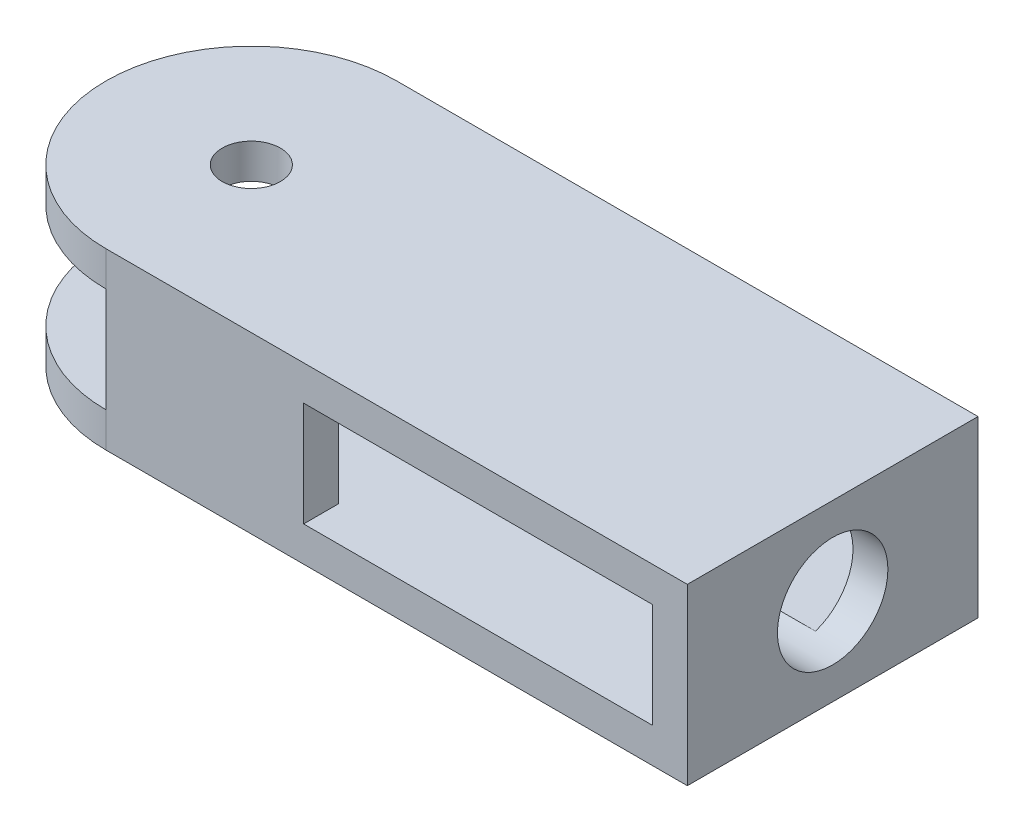
ISO-10303-21;
HEADER;
FILE_DESCRIPTION(('STEP AP214'),'2;1');
FILE_NAME('part.step','',(''),(''),'','','');
FILE_SCHEMA(('AUTOMOTIVE_DESIGN { 1 0 10303 214 1 1 1 1 }'));
ENDSEC;
DATA;
#1=APPLICATION_CONTEXT('core data for automotive mechanical design processes');
#2=APPLICATION_PROTOCOL_DEFINITION('international standard','automotive_design',2000,#1);
#3=PRODUCT_CONTEXT('',#1,'mechanical');
#4=PRODUCT('Part','Part','',(#3));
#5=PRODUCT_RELATED_PRODUCT_CATEGORY('part','',(#4));
#6=PRODUCT_DEFINITION_FORMATION('','',#4);
#7=PRODUCT_DEFINITION_CONTEXT('part definition',#1,'design');
#8=PRODUCT_DEFINITION('design','',#6,#7);
#9=PRODUCT_DEFINITION_SHAPE('','',#8);
#10=(LENGTH_UNIT() NAMED_UNIT(*) SI_UNIT(.MILLI.,.METRE.));
#11=(NAMED_UNIT(*) PLANE_ANGLE_UNIT() SI_UNIT($,.RADIAN.));
#12=(NAMED_UNIT(*) SI_UNIT($,.STERADIAN.) SOLID_ANGLE_UNIT());
#13=UNCERTAINTY_MEASURE_WITH_UNIT(LENGTH_MEASURE(1.E-05),#10,'distance_accuracy_value','');
#14=(GEOMETRIC_REPRESENTATION_CONTEXT(3) GLOBAL_UNCERTAINTY_ASSIGNED_CONTEXT((#13)) GLOBAL_UNIT_ASSIGNED_CONTEXT((#10,
#11,#12)) REPRESENTATION_CONTEXT('',''));
#15=CARTESIAN_POINT('',(0.,0.,0.));
#16=DIRECTION('',(0.,0.,1.));
#17=DIRECTION('',(1.,0.,0.));
#18=AXIS2_PLACEMENT_3D('',#15,#16,#17);
#19=CARTESIAN_POINT('',(-50.,15.,0.));
#20=DIRECTION('',(0.,-1.,0.));
#21=DIRECTION('',(0.,0.,-1.));
#22=AXIS2_PLACEMENT_3D('',#19,#20,#21);
#23=CYLINDRICAL_SURFACE('',#22,5.);
#24=CARTESIAN_POINT('',(-50.,-9.,0.));
#25=DIRECTION('',(0.,-1.,0.));
#26=DIRECTION('',(1.,0.,0.));
#27=AXIS2_PLACEMENT_3D('',#24,#25,#26);
#28=CIRCLE('',#27,5.);
#29=CARTESIAN_POINT('',(-45.,-9.,0.));
#30=VERTEX_POINT('',#29);
#31=EDGE_CURVE('E43',#30,#30,#28,.T.);
#32=ORIENTED_EDGE('',*,*,#31,.F.);
#33=EDGE_LOOP('',(#32));
#34=FACE_BOUND('',#33,.T.);
#35=CARTESIAN_POINT('',(-50.,-15.,0.));
#36=DIRECTION('',(0.,1.,0.));
#37=DIRECTION('',(0.,0.,1.));
#38=AXIS2_PLACEMENT_3D('',#35,#36,#37);
#39=CIRCLE('',#38,5.);
#40=CARTESIAN_POINT('',(-50.,-15.,5.));
#41=VERTEX_POINT('',#40);
#42=EDGE_CURVE('E239',#41,#41,#39,.T.);
#43=ORIENTED_EDGE('',*,*,#42,.F.);
#44=EDGE_LOOP('',(#43));
#45=FACE_BOUND('',#44,.T.);
#46=ADVANCED_FACE('F35',(#34,#45),#23,.F.);
#47=CARTESIAN_POINT('',(-16.,9.,-25.));
#48=DIRECTION('',(-1.,0.,0.));
#49=DIRECTION('',(0.,0.,1.));
#50=AXIS2_PLACEMENT_3D('',#47,#48,#49);
#51=PLANE('',#50);
#52=DIRECTION('',(0.,0.,1.));
#53=VECTOR('',#52,1.);
#54=CARTESIAN_POINT('',(-16.,9.,-25.));
#55=LINE('',#54,#53);
#56=CARTESIAN_POINT('',(-16.,9.,-25.));
#57=VERTEX_POINT('',#56);
#58=CARTESIAN_POINT('',(-16.,9.,-19.));
#59=VERTEX_POINT('',#58);
#60=EDGE_CURVE('E187',#57,#59,#55,.T.);
#61=ORIENTED_EDGE('',*,*,#60,.T.);
#62=DIRECTION('',(0.,1.,0.));
#63=VECTOR('',#62,1.);
#64=CARTESIAN_POINT('',(-16.,8.99999999999999,-19.));
#65=LINE('',#64,#63);
#66=CARTESIAN_POINT('',(-16.,-9.,-19.));
#67=VERTEX_POINT('',#66);
#68=EDGE_CURVE('E50',#67,#59,#65,.T.);
#69=ORIENTED_EDGE('',*,*,#68,.F.);
#70=DIRECTION('',(0.,0.,1.));
#71=VECTOR('',#70,1.);
#72=CARTESIAN_POINT('',(-16.,-9.,-25.));
#73=LINE('',#72,#71);
#74=CARTESIAN_POINT('',(-16.,-9.,-25.));
#75=VERTEX_POINT('',#74);
#76=EDGE_CURVE('E202',#75,#67,#73,.T.);
#77=ORIENTED_EDGE('',*,*,#76,.F.);
#78=DIRECTION('',(0.,-1.,0.));
#79=VECTOR('',#78,1.);
#80=CARTESIAN_POINT('',(-16.,9.,-25.));
#81=LINE('',#80,#79);
#82=EDGE_CURVE('E377',#57,#75,#81,.T.);
#83=ORIENTED_EDGE('',*,*,#82,.F.);
#84=EDGE_LOOP('',(#61,#69,#77,#83));
#85=FACE_BOUND('',#84,.T.);
#86=ADVANCED_FACE('F299',(#85),#51,.F.);
#87=CARTESIAN_POINT('',(-50.,15.,0.));
#88=DIRECTION('',(0.,-1.,0.));
#89=DIRECTION('',(0.,0.,-1.));
#90=AXIS2_PLACEMENT_3D('',#87,#88,#89);
#91=CYLINDRICAL_SURFACE('',#90,25.);
#92=DIRECTION('',(0.,-1.,0.));
#93=VECTOR('',#92,1.);
#94=CARTESIAN_POINT('',(-50.,15.,25.));
#95=LINE('',#94,#93);
#96=CARTESIAN_POINT('',(-50.,-9.,25.));
#97=VERTEX_POINT('',#96);
#98=CARTESIAN_POINT('',(-50.,-15.,25.));
#99=VERTEX_POINT('',#98);
#100=EDGE_CURVE('E271',#97,#99,#95,.T.);
#101=ORIENTED_EDGE('',*,*,#100,.F.);
#102=CARTESIAN_POINT('',(-50.,-9.,0.));
#103=DIRECTION('',(0.,-1.,0.));
#104=DIRECTION('',(1.,0.,0.));
#105=AXIS2_PLACEMENT_3D('',#102,#103,#104);
#106=CIRCLE('',#105,25.);
#107=CARTESIAN_POINT('',(-50.,-9.,-25.));
#108=VERTEX_POINT('',#107);
#109=EDGE_CURVE('E233',#97,#108,#106,.T.);
#110=ORIENTED_EDGE('',*,*,#109,.T.);
#111=DIRECTION('',(0.,-1.,0.));
#112=VECTOR('',#111,1.);
#113=CARTESIAN_POINT('',(-50.,15.,-25.));
#114=LINE('',#113,#112);
#115=CARTESIAN_POINT('',(-50.,-15.,-25.));
#116=VERTEX_POINT('',#115);
#117=EDGE_CURVE('E275',#108,#116,#114,.T.);
#118=ORIENTED_EDGE('',*,*,#117,.T.);
#119=CARTESIAN_POINT('',(-50.,-15.,0.));
#120=DIRECTION('',(0.,1.,0.));
#121=DIRECTION('',(0.,0.,1.));
#122=AXIS2_PLACEMENT_3D('',#119,#120,#121);
#123=CIRCLE('',#122,25.);
#124=EDGE_CURVE('E265',#116,#99,#123,.T.);
#125=ORIENTED_EDGE('',*,*,#124,.T.);
#126=EDGE_LOOP('',(#101,#110,#118,#125));
#127=FACE_BOUND('',#126,.T.);
#128=ADVANCED_FACE('F327',(#127),#91,.T.);
#129=CARTESIAN_POINT('',(0.,0.,0.));
#130=DIRECTION('',(1.,0.,0.));
#131=DIRECTION('',(0.,0.,-1.));
#132=AXIS2_PLACEMENT_3D('',#129,#130,#131);
#133=PLANE('',#132);
#134=DIRECTION('',(0.,0.,1.));
#135=VECTOR('',#134,1.);
#136=CARTESIAN_POINT('',(0.,9.,0.));
#137=LINE('',#136,#135);
#138=CARTESIAN_POINT('',(0.,9.,-3.04138126514911));
#139=VERTEX_POINT('',#138);
#140=CARTESIAN_POINT('',(0.,9.,3.04138126514911));
#141=VERTEX_POINT('',#140);
#142=EDGE_CURVE('E284',#139,#141,#137,.T.);
#143=ORIENTED_EDGE('',*,*,#142,.F.);
#144=CARTESIAN_POINT('',(0.,0.,0.));
#145=DIRECTION('',(1.,0.,0.));
#146=DIRECTION('',(0.,0.,-1.));
#147=AXIS2_PLACEMENT_3D('',#144,#145,#146);
#148=CIRCLE('',#147,9.5);
#149=EDGE_CURVE('E236',#139,#141,#148,.T.);
#150=ORIENTED_EDGE('',*,*,#149,.T.);
#151=EDGE_LOOP('',(#143,#150));
#152=FACE_BOUND('',#151,.T.);
#153=ADVANCED_FACE('F315',(#152),#133,.T.);
#154=CARTESIAN_POINT('',(-50.,15.,0.));
#155=DIRECTION('',(0.,1.,0.));
#156=DIRECTION('',(0.,0.,1.));
#157=AXIS2_PLACEMENT_3D('',#154,#155,#156);
#158=PLANE('',#157);
#159=DIRECTION('',(0.,0.,-1.));
#160=VECTOR('',#159,1.);
#161=CARTESIAN_POINT('',(50.,15.,-25.));
#162=LINE('',#161,#160);
#163=CARTESIAN_POINT('',(50.,15.,25.));
#164=VERTEX_POINT('',#163);
#165=CARTESIAN_POINT('',(50.,15.,-25.));
#166=VERTEX_POINT('',#165);
#167=EDGE_CURVE('E249',#164,#166,#162,.T.);
#168=ORIENTED_EDGE('',*,*,#167,.T.);
#169=DIRECTION('',(-1.,0.,0.));
#170=VECTOR('',#169,1.);
#171=CARTESIAN_POINT('',(-50.,15.,-25.));
#172=LINE('',#171,#170);
#173=CARTESIAN_POINT('',(-50.,15.,-25.));
#174=VERTEX_POINT('',#173);
#175=EDGE_CURVE('E252',#166,#174,#172,.T.);
#176=ORIENTED_EDGE('',*,*,#175,.T.);
#177=CARTESIAN_POINT('',(-50.,15.,0.));
#178=DIRECTION('',(0.,1.,0.));
#179=DIRECTION('',(0.,0.,1.));
#180=AXIS2_PLACEMENT_3D('',#177,#178,#179);
#181=CIRCLE('',#180,25.);
#182=CARTESIAN_POINT('',(-50.,15.,25.));
#183=VERTEX_POINT('',#182);
#184=EDGE_CURVE('E255',#174,#183,#181,.T.);
#185=ORIENTED_EDGE('',*,*,#184,.T.);
#186=DIRECTION('',(1.,0.,0.));
#187=VECTOR('',#186,1.);
#188=CARTESIAN_POINT('',(-50.,15.,25.));
#189=LINE('',#188,#187);
#190=EDGE_CURVE('E257',#183,#164,#189,.T.);
#191=ORIENTED_EDGE('',*,*,#190,.T.);
#192=EDGE_LOOP('',(#168,#176,#185,#191));
#193=FACE_BOUND('',#192,.T.);
#194=CARTESIAN_POINT('',(-50.,15.,0.));
#195=DIRECTION('',(0.,1.,0.));
#196=DIRECTION('',(0.,0.,1.));
#197=AXIS2_PLACEMENT_3D('',#194,#195,#196);
#198=CIRCLE('',#197,5.);
#199=CARTESIAN_POINT('',(-50.,15.,5.));
#200=VERTEX_POINT('',#199);
#201=EDGE_CURVE('E243',#200,#200,#198,.T.);
#202=ORIENTED_EDGE('',*,*,#201,.F.);
#203=EDGE_LOOP('',(#202));
#204=FACE_BOUND('',#203,.T.);
#205=ADVANCED_FACE('F306',(#193,#204),#158,.T.);
#206=CARTESIAN_POINT('',(-50.,-15.,0.));
#207=DIRECTION('',(0.,1.,0.));
#208=DIRECTION('',(0.,0.,1.));
#209=AXIS2_PLACEMENT_3D('',#206,#207,#208);
#210=PLANE('',#209);
#211=DIRECTION('',(0.,0.,-1.));
#212=VECTOR('',#211,1.);
#213=CARTESIAN_POINT('',(50.,-15.,-25.));
#214=LINE('',#213,#212);
#215=CARTESIAN_POINT('',(50.,-15.,25.));
#216=VERTEX_POINT('',#215);
#217=CARTESIAN_POINT('',(50.,-15.,-25.));
#218=VERTEX_POINT('',#217);
#219=EDGE_CURVE('E246',#216,#218,#214,.T.);
#220=ORIENTED_EDGE('',*,*,#219,.F.);
#221=DIRECTION('',(1.,0.,0.));
#222=VECTOR('',#221,1.);
#223=CARTESIAN_POINT('',(-50.,-15.,25.));
#224=LINE('',#223,#222);
#225=EDGE_CURVE('E253',#99,#216,#224,.T.);
#226=ORIENTED_EDGE('',*,*,#225,.F.);
#227=ORIENTED_EDGE('',*,*,#124,.F.);
#228=DIRECTION('',(-1.,0.,0.));
#229=VECTOR('',#228,1.);
#230=CARTESIAN_POINT('',(-50.,-15.,-25.));
#231=LINE('',#230,#229);
#232=EDGE_CURVE('E262',#218,#116,#231,.T.);
#233=ORIENTED_EDGE('',*,*,#232,.F.);
#234=EDGE_LOOP('',(#220,#226,#227,#233));
#235=FACE_BOUND('',#234,.T.);
#236=ORIENTED_EDGE('',*,*,#42,.T.);
#237=EDGE_LOOP('',(#236));
#238=FACE_BOUND('',#237,.T.);
#239=ADVANCED_FACE('F304',(#235,#238),#210,.F.);
#240=CARTESIAN_POINT('',(50.,15.,-25.));
#241=DIRECTION('',(-1.,0.,0.));
#242=DIRECTION('',(0.,0.,1.));
#243=AXIS2_PLACEMENT_3D('',#240,#241,#242);
#244=PLANE('',#243);
#245=CARTESIAN_POINT('',(50.,0.,0.));
#246=DIRECTION('',(1.,0.,0.));
#247=DIRECTION('',(0.,0.,-1.));
#248=AXIS2_PLACEMENT_3D('',#245,#246,#247);
#249=CIRCLE('',#248,9.5);
#250=CARTESIAN_POINT('',(50.,0.,-9.5));
#251=VERTEX_POINT('',#250);
#252=EDGE_CURVE('E235',#251,#251,#249,.T.);
#253=ORIENTED_EDGE('',*,*,#252,.F.);
#254=EDGE_LOOP('',(#253));
#255=FACE_BOUND('',#254,.T.);
#256=ORIENTED_EDGE('',*,*,#219,.T.);
#257=DIRECTION('',(0.,-1.,0.));
#258=VECTOR('',#257,1.);
#259=CARTESIAN_POINT('',(50.,15.,-25.));
#260=LINE('',#259,#258);
#261=EDGE_CURVE('E279',#166,#218,#260,.T.);
#262=ORIENTED_EDGE('',*,*,#261,.F.);
#263=ORIENTED_EDGE('',*,*,#167,.F.);
#264=DIRECTION('',(0.,-1.,0.));
#265=VECTOR('',#264,1.);
#266=CARTESIAN_POINT('',(50.,15.,25.));
#267=LINE('',#266,#265);
#268=EDGE_CURVE('E259',#164,#216,#267,.T.);
#269=ORIENTED_EDGE('',*,*,#268,.T.);
#270=EDGE_LOOP('',(#256,#262,#263,#269));
#271=FACE_BOUND('',#270,.T.);
#272=ADVANCED_FACE('F37',(#255,#271),#244,.F.);
#273=CARTESIAN_POINT('',(-50.,15.,-25.));
#274=DIRECTION('',(0.,0.,1.));
#275=DIRECTION('',(1.,0.,0.));
#276=AXIS2_PLACEMENT_3D('',#273,#274,#275);
#277=PLANE('',#276);
#278=DIRECTION('',(-1.,0.,0.));
#279=VECTOR('',#278,1.);
#280=CARTESIAN_POINT('',(-16.,9.,-25.));
#281=LINE('',#280,#279);
#282=CARTESIAN_POINT('',(44.,9.,-25.));
#283=VERTEX_POINT('',#282);
#284=EDGE_CURVE('E196',#283,#57,#281,.T.);
#285=ORIENTED_EDGE('',*,*,#284,.T.);
#286=ORIENTED_EDGE('',*,*,#82,.T.);
#287=DIRECTION('',(1.,0.,0.));
#288=VECTOR('',#287,1.);
#289=CARTESIAN_POINT('',(-16.,-9.,-25.));
#290=LINE('',#289,#288);
#291=CARTESIAN_POINT('',(44.,-9.,-25.));
#292=VERTEX_POINT('',#291);
#293=EDGE_CURVE('E379',#75,#292,#290,.T.);
#294=ORIENTED_EDGE('',*,*,#293,.T.);
#295=DIRECTION('',(0.,1.,0.));
#296=VECTOR('',#295,1.);
#297=CARTESIAN_POINT('',(44.,9.,-25.));
#298=LINE('',#297,#296);
#299=EDGE_CURVE('E58',#292,#283,#298,.T.);
#300=ORIENTED_EDGE('',*,*,#299,.T.);
#301=EDGE_LOOP('',(#285,#286,#294,#300));
#302=FACE_BOUND('',#301,.T.);
#303=ORIENTED_EDGE('',*,*,#232,.T.);
#304=ORIENTED_EDGE('',*,*,#117,.F.);
#305=DIRECTION('',(0.,1.,0.));
#306=VECTOR('',#305,1.);
#307=CARTESIAN_POINT('',(-50.,9.,-25.));
#308=LINE('',#307,#306);
#309=CARTESIAN_POINT('',(-50.,9.,-25.));
#310=VERTEX_POINT('',#309);
#311=EDGE_CURVE('E208',#108,#310,#308,.T.);
#312=ORIENTED_EDGE('',*,*,#311,.T.);
#313=EDGE_CURVE('E276',#174,#310,#114,.T.);
#314=ORIENTED_EDGE('',*,*,#313,.F.);
#315=ORIENTED_EDGE('',*,*,#175,.F.);
#316=ORIENTED_EDGE('',*,*,#261,.T.);
#317=EDGE_LOOP('',(#303,#304,#312,#314,#315,#316));
#318=FACE_BOUND('',#317,.T.);
#319=ADVANCED_FACE('F313',(#302,#318),#277,.F.);
#320=CARTESIAN_POINT('',(-50.,9.,0.));
#321=DIRECTION('',(0.,1.,0.));
#322=DIRECTION('',(-1.,0.,0.));
#323=AXIS2_PLACEMENT_3D('',#320,#321,#322);
#324=CIRCLE('',#323,25.);
#325=CARTESIAN_POINT('',(-50.,9.,25.));
#326=VERTEX_POINT('',#325);
#327=EDGE_CURVE('E231',#310,#326,#324,.T.);
#328=ORIENTED_EDGE('',*,*,#327,.T.);
#329=EDGE_CURVE('E272',#183,#326,#95,.T.);
#330=ORIENTED_EDGE('',*,*,#329,.F.);
#331=ORIENTED_EDGE('',*,*,#184,.F.);
#332=ORIENTED_EDGE('',*,*,#313,.T.);
#333=EDGE_LOOP('',(#328,#330,#331,#332));
#334=FACE_BOUND('',#333,.T.);
#335=ADVANCED_FACE('F323',(#334),#91,.T.);
#336=CARTESIAN_POINT('',(-50.,15.,25.));
#337=DIRECTION('',(0.,0.,-1.));
#338=DIRECTION('',(-1.,0.,0.));
#339=AXIS2_PLACEMENT_3D('',#336,#337,#338);
#340=PLANE('',#339);
#341=DIRECTION('',(1.,0.,0.));
#342=VECTOR('',#341,1.);
#343=CARTESIAN_POINT('',(-16.,-9.,25.));
#344=LINE('',#343,#342);
#345=CARTESIAN_POINT('',(-16.,-9.,25.));
#346=VERTEX_POINT('',#345);
#347=CARTESIAN_POINT('',(44.,-9.,25.));
#348=VERTEX_POINT('',#347);
#349=EDGE_CURVE('E371',#346,#348,#344,.T.);
#350=ORIENTED_EDGE('',*,*,#349,.F.);
#351=DIRECTION('',(0.,-1.,0.));
#352=VECTOR('',#351,1.);
#353=CARTESIAN_POINT('',(-16.,9.,25.));
#354=LINE('',#353,#352);
#355=CARTESIAN_POINT('',(-16.,9.,25.));
#356=VERTEX_POINT('',#355);
#357=EDGE_CURVE('E215',#356,#346,#354,.T.);
#358=ORIENTED_EDGE('',*,*,#357,.F.);
#359=DIRECTION('',(-1.,0.,0.));
#360=VECTOR('',#359,1.);
#361=CARTESIAN_POINT('',(-16.,9.,25.));
#362=LINE('',#361,#360);
#363=CARTESIAN_POINT('',(44.,9.,25.));
#364=VERTEX_POINT('',#363);
#365=EDGE_CURVE('E185',#364,#356,#362,.T.);
#366=ORIENTED_EDGE('',*,*,#365,.F.);
#367=DIRECTION('',(0.,1.,0.));
#368=VECTOR('',#367,1.);
#369=CARTESIAN_POINT('',(44.,9.,25.));
#370=LINE('',#369,#368);
#371=EDGE_CURVE('E373',#348,#364,#370,.T.);
#372=ORIENTED_EDGE('',*,*,#371,.F.);
#373=EDGE_LOOP('',(#350,#358,#366,#372));
#374=FACE_BOUND('',#373,.T.);
#375=ORIENTED_EDGE('',*,*,#225,.T.);
#376=ORIENTED_EDGE('',*,*,#268,.F.);
#377=ORIENTED_EDGE('',*,*,#190,.F.);
#378=ORIENTED_EDGE('',*,*,#329,.T.);
#379=DIRECTION('',(0.,1.,0.));
#380=VECTOR('',#379,1.);
#381=CARTESIAN_POINT('',(-50.,9.,25.));
#382=LINE('',#381,#380);
#383=EDGE_CURVE('E205',#97,#326,#382,.T.);
#384=ORIENTED_EDGE('',*,*,#383,.F.);
#385=ORIENTED_EDGE('',*,*,#100,.T.);
#386=EDGE_LOOP('',(#375,#376,#377,#378,#384,#385));
#387=FACE_BOUND('',#386,.T.);
#388=ADVANCED_FACE('F320',(#374,#387),#340,.F.);
#389=CARTESIAN_POINT('',(-50.,9.,0.));
#390=DIRECTION('',(0.,1.,0.));
#391=DIRECTION('',(-1.,0.,0.));
#392=AXIS2_PLACEMENT_3D('',#389,#390,#391);
#393=CIRCLE('',#392,5.);
#394=CARTESIAN_POINT('',(-55.,9.,0.));
#395=VERTEX_POINT('',#394);
#396=EDGE_CURVE('E290',#395,#395,#393,.T.);
#397=ORIENTED_EDGE('',*,*,#396,.F.);
#398=EDGE_LOOP('',(#397));
#399=FACE_BOUND('',#398,.T.);
#400=ORIENTED_EDGE('',*,*,#201,.T.);
#401=EDGE_LOOP('',(#400));
#402=FACE_BOUND('',#401,.T.);
#403=ADVANCED_FACE('F301',(#399,#402),#23,.F.);
#404=CARTESIAN_POINT('',(0.,0.,0.));
#405=DIRECTION('',(1.,0.,0.));
#406=DIRECTION('',(0.,0.,-1.));
#407=AXIS2_PLACEMENT_3D('',#404,#405,#406);
#408=CYLINDRICAL_SURFACE('',#407,9.5);
#409=ORIENTED_EDGE('',*,*,#149,.F.);
#410=DIRECTION('',(1.,0.,0.));
#411=VECTOR('',#410,1.);
#412=CARTESIAN_POINT('',(0.,9.,-3.04138126514912));
#413=LINE('',#412,#411);
#414=CARTESIAN_POINT('',(44.,9.,-3.04138126514911));
#415=VERTEX_POINT('',#414);
#416=EDGE_CURVE('E225',#139,#415,#413,.T.);
#417=ORIENTED_EDGE('',*,*,#416,.T.);
#418=CARTESIAN_POINT('',(44.,0.,0.));
#419=DIRECTION('',(1.,0.,0.));
#420=DIRECTION('',(0.,0.,-1.));
#421=AXIS2_PLACEMENT_3D('',#418,#419,#420);
#422=CIRCLE('',#421,9.5);
#423=CARTESIAN_POINT('',(44.,-9.,-3.04138126514912));
#424=VERTEX_POINT('',#423);
#425=EDGE_CURVE('E289',#415,#424,#422,.F.);
#426=ORIENTED_EDGE('',*,*,#425,.T.);
#427=DIRECTION('',(1.,0.,0.));
#428=VECTOR('',#427,1.);
#429=CARTESIAN_POINT('',(0.,-9.,-3.04138126514912));
#430=LINE('',#429,#428);
#431=CARTESIAN_POINT('',(0.,-9.,-3.04138126514911));
#432=VERTEX_POINT('',#431);
#433=EDGE_CURVE('E222',#424,#432,#430,.F.);
#434=ORIENTED_EDGE('',*,*,#433,.T.);
#435=CARTESIAN_POINT('',(0.,-9.,3.04138126514911));
#436=VERTEX_POINT('',#435);
#437=EDGE_CURVE('E240',#436,#432,#148,.T.);
#438=ORIENTED_EDGE('',*,*,#437,.F.);
#439=DIRECTION('',(1.,0.,0.));
#440=VECTOR('',#439,1.);
#441=CARTESIAN_POINT('',(0.,-9.,3.04138126514912));
#442=LINE('',#441,#440);
#443=CARTESIAN_POINT('',(44.,-9.,3.04138126514912));
#444=VERTEX_POINT('',#443);
#445=EDGE_CURVE('E191',#436,#444,#442,.T.);
#446=ORIENTED_EDGE('',*,*,#445,.T.);
#447=CARTESIAN_POINT('',(44.,9.,3.04138126514911));
#448=VERTEX_POINT('',#447);
#449=EDGE_CURVE('E286',#444,#448,#422,.F.);
#450=ORIENTED_EDGE('',*,*,#449,.T.);
#451=DIRECTION('',(1.,0.,0.));
#452=VECTOR('',#451,1.);
#453=CARTESIAN_POINT('',(0.,9.,3.04138126514912));
#454=LINE('',#453,#452);
#455=EDGE_CURVE('E228',#448,#141,#454,.F.);
#456=ORIENTED_EDGE('',*,*,#455,.T.);
#457=EDGE_LOOP('',(#409,#417,#426,#434,#438,#446,#450,#456));
#458=FACE_BOUND('',#457,.T.);
#459=ORIENTED_EDGE('',*,*,#252,.T.);
#460=EDGE_LOOP('',(#459));
#461=FACE_BOUND('',#460,.T.);
#462=ADVANCED_FACE('F387',(#458,#461),#408,.F.);
#463=DIRECTION('',(0.,0.,-1.));
#464=VECTOR('',#463,1.);
#465=CARTESIAN_POINT('',(0.,-9.,0.));
#466=LINE('',#465,#464);
#467=EDGE_CURVE('E282',#436,#432,#466,.T.);
#468=ORIENTED_EDGE('',*,*,#467,.F.);
#469=ORIENTED_EDGE('',*,*,#437,.T.);
#470=EDGE_LOOP('',(#468,#469));
#471=FACE_BOUND('',#470,.T.);
#472=ADVANCED_FACE('F395',(#471),#133,.T.);
#473=CARTESIAN_POINT('',(44.,9.,-25.));
#474=DIRECTION('',(1.,0.,0.));
#475=DIRECTION('',(0.,0.,-1.));
#476=AXIS2_PLACEMENT_3D('',#473,#474,#475);
#477=PLANE('',#476);
#478=DIRECTION('',(0.,0.,1.));
#479=VECTOR('',#478,1.);
#480=CARTESIAN_POINT('',(44.,-9.,-25.));
#481=LINE('',#480,#479);
#482=EDGE_CURVE('E201',#444,#348,#481,.T.);
#483=ORIENTED_EDGE('',*,*,#482,.T.);
#484=ORIENTED_EDGE('',*,*,#371,.T.);
#485=DIRECTION('',(0.,0.,1.));
#486=VECTOR('',#485,1.);
#487=CARTESIAN_POINT('',(44.,9.,-25.));
#488=LINE('',#487,#486);
#489=EDGE_CURVE('E193',#448,#364,#488,.T.);
#490=ORIENTED_EDGE('',*,*,#489,.F.);
#491=ORIENTED_EDGE('',*,*,#449,.F.);
#492=EDGE_LOOP('',(#483,#484,#490,#491));
#493=FACE_BOUND('',#492,.T.);
#494=ADVANCED_FACE('F402',(#493),#477,.F.);
#495=EDGE_CURVE('E188',#283,#415,#488,.T.);
#496=ORIENTED_EDGE('',*,*,#495,.F.);
#497=ORIENTED_EDGE('',*,*,#299,.F.);
#498=EDGE_CURVE('E199',#292,#424,#481,.T.);
#499=ORIENTED_EDGE('',*,*,#498,.T.);
#500=ORIENTED_EDGE('',*,*,#425,.F.);
#501=EDGE_LOOP('',(#496,#497,#499,#500));
#502=FACE_BOUND('',#501,.T.);
#503=ADVANCED_FACE('F384',(#502),#477,.F.);
#504=CARTESIAN_POINT('',(-16.,9.,-25.));
#505=DIRECTION('',(0.,1.,0.));
#506=DIRECTION('',(0.,0.,1.));
#507=AXIS2_PLACEMENT_3D('',#504,#505,#506);
#508=PLANE('',#507);
#509=ORIENTED_EDGE('',*,*,#489,.T.);
#510=ORIENTED_EDGE('',*,*,#365,.T.);
#511=CARTESIAN_POINT('',(-16.,8.99999999999999,19.));
#512=VERTEX_POINT('',#511);
#513=EDGE_CURVE('E178',#512,#356,#55,.T.);
#514=ORIENTED_EDGE('',*,*,#513,.F.);
#515=DIRECTION('',(1.,0.,0.));
#516=VECTOR('',#515,1.);
#517=CARTESIAN_POINT('',(-75.,8.99999999999998,19.));
#518=LINE('',#517,#516);
#519=CARTESIAN_POINT('',(-50.,8.99999999999998,19.));
#520=VERTEX_POINT('',#519);
#521=EDGE_CURVE('E161',#520,#512,#518,.T.);
#522=ORIENTED_EDGE('',*,*,#521,.F.);
#523=DIRECTION('',(0.,0.,1.));
#524=VECTOR('',#523,1.);
#525=CARTESIAN_POINT('',(-50.,9.,-25.));
#526=LINE('',#525,#524);
#527=EDGE_CURVE('E211',#520,#326,#526,.T.);
#528=ORIENTED_EDGE('',*,*,#527,.T.);
#529=ORIENTED_EDGE('',*,*,#327,.F.);
#530=CARTESIAN_POINT('',(-50.,8.99999999999998,-19.));
#531=VERTEX_POINT('',#530);
#532=EDGE_CURVE('E217',#310,#531,#526,.T.);
#533=ORIENTED_EDGE('',*,*,#532,.T.);
#534=DIRECTION('',(1.,0.,0.));
#535=VECTOR('',#534,1.);
#536=CARTESIAN_POINT('',(-75.,8.99999999999998,-19.));
#537=LINE('',#536,#535);
#538=EDGE_CURVE('E173',#531,#59,#537,.T.);
#539=ORIENTED_EDGE('',*,*,#538,.T.);
#540=ORIENTED_EDGE('',*,*,#60,.F.);
#541=ORIENTED_EDGE('',*,*,#284,.F.);
#542=ORIENTED_EDGE('',*,*,#495,.T.);
#543=ORIENTED_EDGE('',*,*,#416,.F.);
#544=ORIENTED_EDGE('',*,*,#142,.T.);
#545=ORIENTED_EDGE('',*,*,#455,.F.);
#546=EDGE_LOOP('',(#509,#510,#514,#522,#528,#529,#533,#539,#540,#541,#542,#543,#544,#545));
#547=FACE_BOUND('',#546,.T.);
#548=ORIENTED_EDGE('',*,*,#396,.T.);
#549=EDGE_LOOP('',(#548));
#550=FACE_BOUND('',#549,.T.);
#551=ADVANCED_FACE('F182',(#547,#550),#508,.F.);
#552=CARTESIAN_POINT('',(-16.,-9.,-25.));
#553=DIRECTION('',(0.,-1.,0.));
#554=DIRECTION('',(0.,0.,-1.));
#555=AXIS2_PLACEMENT_3D('',#552,#553,#554);
#556=PLANE('',#555);
#557=ORIENTED_EDGE('',*,*,#498,.F.);
#558=ORIENTED_EDGE('',*,*,#293,.F.);
#559=ORIENTED_EDGE('',*,*,#76,.T.);
#560=DIRECTION('',(1.,0.,0.));
#561=VECTOR('',#560,1.);
#562=CARTESIAN_POINT('',(-75.,-9.00000000000001,-19.));
#563=LINE('',#562,#561);
#564=CARTESIAN_POINT('',(-50.,-9.,-19.));
#565=VERTEX_POINT('',#564);
#566=EDGE_CURVE('E349',#565,#67,#563,.T.);
#567=ORIENTED_EDGE('',*,*,#566,.F.);
#568=DIRECTION('',(0.,0.,1.));
#569=VECTOR('',#568,1.);
#570=CARTESIAN_POINT('',(-50.,-9.,-25.));
#571=LINE('',#570,#569);
#572=EDGE_CURVE('E212',#108,#565,#571,.T.);
#573=ORIENTED_EDGE('',*,*,#572,.F.);
#574=ORIENTED_EDGE('',*,*,#109,.F.);
#575=CARTESIAN_POINT('',(-50.,-9.,19.));
#576=VERTEX_POINT('',#575);
#577=EDGE_CURVE('E216',#576,#97,#571,.T.);
#578=ORIENTED_EDGE('',*,*,#577,.F.);
#579=DIRECTION('',(1.,0.,0.));
#580=VECTOR('',#579,1.);
#581=CARTESIAN_POINT('',(-75.,-9.00000000000001,19.));
#582=LINE('',#581,#580);
#583=CARTESIAN_POINT('',(-16.,-9.,19.));
#584=VERTEX_POINT('',#583);
#585=EDGE_CURVE('E172',#576,#584,#582,.T.);
#586=ORIENTED_EDGE('',*,*,#585,.T.);
#587=EDGE_CURVE('E180',#584,#346,#73,.T.);
#588=ORIENTED_EDGE('',*,*,#587,.T.);
#589=ORIENTED_EDGE('',*,*,#349,.T.);
#590=ORIENTED_EDGE('',*,*,#482,.F.);
#591=ORIENTED_EDGE('',*,*,#445,.F.);
#592=ORIENTED_EDGE('',*,*,#467,.T.);
#593=ORIENTED_EDGE('',*,*,#433,.F.);
#594=EDGE_LOOP('',(#557,#558,#559,#567,#573,#574,#578,#586,#588,#589,#590,#591,#592,#593));
#595=FACE_BOUND('',#594,.T.);
#596=ORIENTED_EDGE('',*,*,#31,.T.);
#597=EDGE_LOOP('',(#596));
#598=FACE_BOUND('',#597,.T.);
#599=ADVANCED_FACE('F295',(#595,#598),#556,.F.);
#600=ORIENTED_EDGE('',*,*,#587,.F.);
#601=DIRECTION('',(0.,-1.,0.));
#602=VECTOR('',#601,1.);
#603=CARTESIAN_POINT('',(-16.,8.99999999999999,19.));
#604=LINE('',#603,#602);
#605=EDGE_CURVE('E164',#512,#584,#604,.T.);
#606=ORIENTED_EDGE('',*,*,#605,.F.);
#607=ORIENTED_EDGE('',*,*,#513,.T.);
#608=ORIENTED_EDGE('',*,*,#357,.T.);
#609=EDGE_LOOP('',(#600,#606,#607,#608));
#610=FACE_BOUND('',#609,.T.);
#611=ADVANCED_FACE('F176',(#610),#51,.F.);
#612=CARTESIAN_POINT('',(-50.,9.,-25.));
#613=DIRECTION('',(1.,0.,0.));
#614=DIRECTION('',(0.,0.,-1.));
#615=AXIS2_PLACEMENT_3D('',#612,#613,#614);
#616=PLANE('',#615);
#617=ORIENTED_EDGE('',*,*,#527,.F.);
#618=DIRECTION('',(0.,-1.,0.));
#619=VECTOR('',#618,1.);
#620=CARTESIAN_POINT('',(-50.,9.,19.));
#621=LINE('',#620,#619);
#622=EDGE_CURVE('E167',#520,#576,#621,.T.);
#623=ORIENTED_EDGE('',*,*,#622,.T.);
#624=ORIENTED_EDGE('',*,*,#577,.T.);
#625=ORIENTED_EDGE('',*,*,#383,.T.);
#626=EDGE_LOOP('',(#617,#623,#624,#625));
#627=FACE_BOUND('',#626,.T.);
#628=ADVANCED_FACE('F363',(#627),#616,.F.);
#629=ORIENTED_EDGE('',*,*,#572,.T.);
#630=DIRECTION('',(0.,1.,0.));
#631=VECTOR('',#630,1.);
#632=CARTESIAN_POINT('',(-50.,9.,-19.));
#633=LINE('',#632,#631);
#634=EDGE_CURVE('E11',#565,#531,#633,.T.);
#635=ORIENTED_EDGE('',*,*,#634,.T.);
#636=ORIENTED_EDGE('',*,*,#532,.F.);
#637=ORIENTED_EDGE('',*,*,#311,.F.);
#638=EDGE_LOOP('',(#629,#635,#636,#637));
#639=FACE_BOUND('',#638,.T.);
#640=ADVANCED_FACE('F352',(#639),#616,.F.);
#641=CARTESIAN_POINT('',(-75.,8.99999999999998,19.));
#642=DIRECTION('',(0.,0.,1.));
#643=DIRECTION('',(1.,0.,0.));
#644=AXIS2_PLACEMENT_3D('',#641,#642,#643);
#645=PLANE('',#644);
#646=ORIENTED_EDGE('',*,*,#521,.T.);
#647=ORIENTED_EDGE('',*,*,#605,.T.);
#648=ORIENTED_EDGE('',*,*,#585,.F.);
#649=ORIENTED_EDGE('',*,*,#622,.F.);
#650=EDGE_LOOP('',(#646,#647,#648,#649));
#651=FACE_BOUND('',#650,.T.);
#652=ADVANCED_FACE('F163',(#651),#645,.F.);
#653=CARTESIAN_POINT('',(-75.,8.99999999999998,-19.));
#654=DIRECTION('',(0.,0.,-1.));
#655=DIRECTION('',(-1.,0.,0.));
#656=AXIS2_PLACEMENT_3D('',#653,#654,#655);
#657=PLANE('',#656);
#658=ORIENTED_EDGE('',*,*,#566,.T.);
#659=ORIENTED_EDGE('',*,*,#68,.T.);
#660=ORIENTED_EDGE('',*,*,#538,.F.);
#661=ORIENTED_EDGE('',*,*,#634,.F.);
#662=EDGE_LOOP('',(#658,#659,#660,#661));
#663=FACE_BOUND('',#662,.T.);
#664=ADVANCED_FACE('F432',(#663),#657,.F.);
#665=CLOSED_SHELL('',(#46,#86,#128,#153,#205,#239,#272,#319,#335,#388,#403,#462,#472,#494,#503,
#551,#599,#611,#628,#640,#652,#664));
#666=MANIFOLD_SOLID_BREP('B2',#665);
#667=ADVANCED_BREP_SHAPE_REPRESENTATION('',(#18,#666),#14);
#668=SHAPE_DEFINITION_REPRESENTATION(#9,#667);
ENDSEC;
END-ISO-10303-21;
